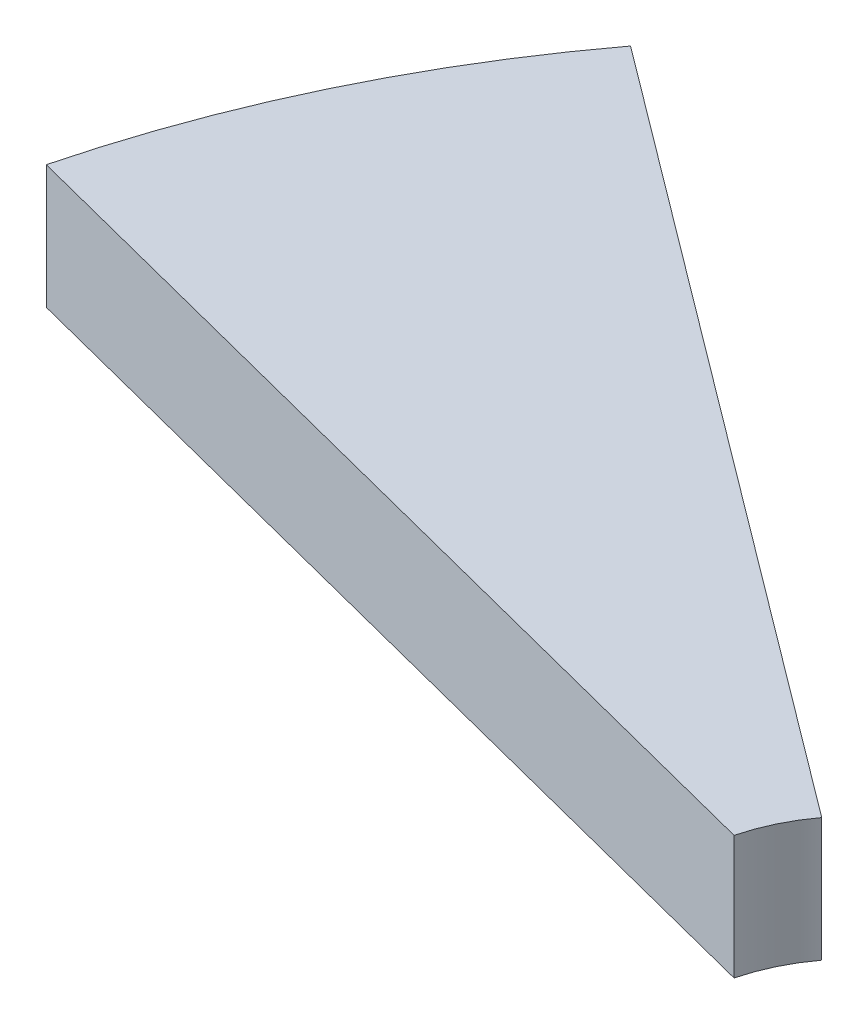
ISO-10303-21;
HEADER;
FILE_DESCRIPTION(('STEP AP214'),'2;1');
FILE_NAME('part.step','',(''),(''),'','','');
FILE_SCHEMA(('AUTOMOTIVE_DESIGN { 1 0 10303 214 1 1 1 1 }'));
ENDSEC;
DATA;
#1=APPLICATION_CONTEXT('core data for automotive mechanical design processes');
#2=APPLICATION_PROTOCOL_DEFINITION('international standard','automotive_design',2000,#1);
#3=PRODUCT_CONTEXT('',#1,'mechanical');
#4=PRODUCT('Part','Part','',(#3));
#5=PRODUCT_RELATED_PRODUCT_CATEGORY('part','',(#4));
#6=PRODUCT_DEFINITION_FORMATION('','',#4);
#7=PRODUCT_DEFINITION_CONTEXT('part definition',#1,'design');
#8=PRODUCT_DEFINITION('design','',#6,#7);
#9=PRODUCT_DEFINITION_SHAPE('','',#8);
#10=(LENGTH_UNIT() NAMED_UNIT(*) SI_UNIT(.MILLI.,.METRE.));
#11=(NAMED_UNIT(*) PLANE_ANGLE_UNIT() SI_UNIT($,.RADIAN.));
#12=(NAMED_UNIT(*) SI_UNIT($,.STERADIAN.) SOLID_ANGLE_UNIT());
#13=UNCERTAINTY_MEASURE_WITH_UNIT(LENGTH_MEASURE(1.E-05),#10,'distance_accuracy_value','');
#14=(GEOMETRIC_REPRESENTATION_CONTEXT(3) GLOBAL_UNCERTAINTY_ASSIGNED_CONTEXT((#13)) GLOBAL_UNIT_ASSIGNED_CONTEXT((#10,
#11,#12)) REPRESENTATION_CONTEXT('',''));
#15=CARTESIAN_POINT('',(0.,0.,0.));
#16=DIRECTION('',(0.,0.,1.));
#17=DIRECTION('',(1.,0.,0.));
#18=AXIS2_PLACEMENT_3D('',#15,#16,#17);
#19=CARTESIAN_POINT('',(-5.76364553610341E-08,252.604579477137,1.13403864458739E-07));
#20=DIRECTION('',(5.59993503864829E-10,-1.,-1.10182641135936E-09));
#21=DIRECTION('',(0.433168727605368,1.23566198245717E-09,-0.901312849916579));
#22=AXIS2_PLACEMENT_3D('',#19,#20,#21);
#23=CYLINDRICAL_SURFACE('',#22,1000.);
#24=CARTESIAN_POINT('',(3.96283006409703E-09,142.604579477137,-7.79704079079124E-09));
#25=DIRECTION('',(-5.59993503864829E-10,1.,1.10182641135936E-09));
#26=DIRECTION('',(-0.433168727605368,-1.23566198245717E-09,0.901312849916579));
#27=AXIS2_PLACEMENT_3D('',#24,#25,#26);
#28=CIRCLE('',#27,1000.);
#29=CARTESIAN_POINT('',(-800.111182686777,142.604579690013,-599.851727798279));
#30=VERTEX_POINT('',#29);
#31=CARTESIAN_POINT('',(-968.713969841785,142.604579208115,-248.179863465115));
#32=VERTEX_POINT('',#31);
#33=EDGE_CURVE('E96',#30,#32,#28,.T.);
#34=ORIENTED_EDGE('',*,*,#33,.T.);
#35=DIRECTION('',(5.59993503864829E-10,-1.,-1.10182641135936E-09));
#36=VECTOR('',#35,1.);
#37=CARTESIAN_POINT('',(-968.713969903384,252.604579208115,-248.179863343914));
#38=LINE('',#37,#36);
#39=CARTESIAN_POINT('',(-968.713969903384,252.604579208115,-248.179863343914));
#40=VERTEX_POINT('',#39);
#41=EDGE_CURVE('E11',#40,#32,#38,.T.);
#42=ORIENTED_EDGE('',*,*,#41,.F.);
#43=CARTESIAN_POINT('',(-5.76364553610341E-08,252.604579477137,1.13403864458739E-07));
#44=DIRECTION('',(-5.59993503864829E-10,1.,1.10182641135936E-09));
#45=DIRECTION('',(-0.433168727605368,-1.23566198245717E-09,0.901312849916579));
#46=AXIS2_PLACEMENT_3D('',#43,#44,#45);
#47=CIRCLE('',#46,1000.);
#48=CARTESIAN_POINT('',(-800.111182748376,252.604579690013,-599.851727677078));
#49=VERTEX_POINT('',#48);
#50=EDGE_CURVE('E84',#49,#40,#47,.T.);
#51=ORIENTED_EDGE('',*,*,#50,.F.);
#52=DIRECTION('',(5.59993503864829E-10,-1.,-1.10182641135936E-09));
#53=VECTOR('',#52,1.);
#54=CARTESIAN_POINT('',(-800.111182748376,252.604579690013,-599.851727677078));
#55=LINE('',#54,#53);
#56=EDGE_CURVE('E92',#49,#30,#55,.T.);
#57=ORIENTED_EDGE('',*,*,#56,.T.);
#58=EDGE_LOOP('',(#34,#42,#51,#57));
#59=FACE_BOUND('',#58,.T.);
#60=ADVANCED_FACE('F33',(#59),#23,.T.);
#61=CARTESIAN_POINT('',(-145.307095534499,252.604579436784,-37.2269794051938));
#62=DIRECTION('',(0.248179863457318,1.20633375432213E-09,-0.968713969845747));
#63=DIRECTION('',(-0.968713969845747,-2.69022402573803E-10,-0.248179863457318));
#64=AXIS2_PLACEMENT_3D('',#61,#62,#63);
#65=PLANE('',#64);
#66=DIRECTION('',(0.968713969845747,2.69022402573803E-10,0.248179863457318));
#67=VECTOR('',#66,1.);
#68=CARTESIAN_POINT('',(-145.307095472899,142.604579436784,-37.2269795263947));
#69=LINE('',#68,#67);
#70=CARTESIAN_POINT('',(-145.307095472899,142.604579436784,-37.2269795263947));
#71=VERTEX_POINT('',#70);
#72=EDGE_CURVE('E88',#32,#71,#69,.T.);
#73=ORIENTED_EDGE('',*,*,#72,.T.);
#74=DIRECTION('',(5.59993503864829E-10,-1.,-1.10182641135936E-09));
#75=VECTOR('',#74,1.);
#76=CARTESIAN_POINT('',(-145.307095534499,252.604579436784,-37.2269794051938));
#77=LINE('',#76,#75);
#78=CARTESIAN_POINT('',(-145.307095534499,252.604579436784,-37.2269794051938));
#79=VERTEX_POINT('',#78);
#80=EDGE_CURVE('E41',#79,#71,#77,.T.);
#81=ORIENTED_EDGE('',*,*,#80,.F.);
#82=DIRECTION('',(0.968713969845747,2.69022402573803E-10,0.248179863457318));
#83=VECTOR('',#82,1.);
#84=CARTESIAN_POINT('',(-145.307095534499,252.604579436784,-37.2269794051938));
#85=LINE('',#84,#83);
#86=EDGE_CURVE('E79',#40,#79,#85,.T.);
#87=ORIENTED_EDGE('',*,*,#86,.F.);
#88=ORIENTED_EDGE('',*,*,#41,.T.);
#89=EDGE_LOOP('',(#73,#81,#87,#88));
#90=FACE_BOUND('',#89,.T.);
#91=ADVANCED_FACE('F87',(#90),#65,.F.);
#92=CARTESIAN_POINT('',(-5.76364553610341E-08,252.604579477137,1.13403864458739E-07));
#93=DIRECTION('',(5.59993503864829E-10,-1.,-1.10182641135936E-09));
#94=DIRECTION('',(0.433168727605368,1.23566198245717E-09,-0.901312849916579));
#95=AXIS2_PLACEMENT_3D('',#92,#93,#94);
#96=CYLINDRICAL_SURFACE('',#95,150.);
#97=CARTESIAN_POINT('',(3.96283006409703E-09,142.604579477137,-7.79704079079124E-09));
#98=DIRECTION('',(5.59993503864829E-10,-1.,-1.10182641135936E-09));
#99=DIRECTION('',(-0.433168727605368,-1.23566198245717E-09,0.901312849916579));
#100=AXIS2_PLACEMENT_3D('',#97,#98,#99);
#101=CIRCLE('',#100,150.);
#102=CARTESIAN_POINT('',(-120.016677399648,142.604579509069,-89.9777591763693));
#103=VERTEX_POINT('',#102);
#104=EDGE_CURVE('E66',#71,#103,#101,.T.);
#105=ORIENTED_EDGE('',*,*,#104,.T.);
#106=DIRECTION('',(5.59993503864829E-10,-1.,-1.10182641135936E-09));
#107=VECTOR('',#106,1.);
#108=CARTESIAN_POINT('',(-120.016677461247,252.604579509069,-89.9777590551684));
#109=LINE('',#108,#107);
#110=CARTESIAN_POINT('',(-120.016677461247,252.604579509069,-89.9777590551684));
#111=VERTEX_POINT('',#110);
#112=EDGE_CURVE('E89',#111,#103,#109,.T.);
#113=ORIENTED_EDGE('',*,*,#112,.F.);
#114=CARTESIAN_POINT('',(-5.76364553610341E-08,252.604579477137,1.13403864458739E-07));
#115=DIRECTION('',(5.59993503864829E-10,-1.,-1.10182641135936E-09));
#116=DIRECTION('',(-0.433168727605368,-1.23566198245717E-09,0.901312849916579));
#117=AXIS2_PLACEMENT_3D('',#114,#115,#116);
#118=CIRCLE('',#117,150.);
#119=EDGE_CURVE('E82',#79,#111,#118,.T.);
#120=ORIENTED_EDGE('',*,*,#119,.F.);
#121=ORIENTED_EDGE('',*,*,#80,.T.);
#122=EDGE_LOOP('',(#105,#113,#120,#121));
#123=FACE_BOUND('',#122,.T.);
#124=ADVANCED_FACE('F90',(#123),#96,.F.);
#125=CARTESIAN_POINT('',(-120.016677461247,252.604579509069,-89.9777590551684));
#126=DIRECTION('',(-0.599851727790482,-1.21749670973159E-09,0.80011118269074));
#127=DIRECTION('',(0.80011118269074,-2.12875413555147E-10,0.599851727790482));
#128=AXIS2_PLACEMENT_3D('',#125,#126,#127);
#129=PLANE('',#128);
#130=DIRECTION('',(-0.80011118269074,2.12875413555147E-10,-0.599851727790482));
#131=VECTOR('',#130,1.);
#132=CARTESIAN_POINT('',(-120.016677399648,142.604579509069,-89.9777591763693));
#133=LINE('',#132,#131);
#134=EDGE_CURVE('E72',#103,#30,#133,.T.);
#135=ORIENTED_EDGE('',*,*,#134,.T.);
#136=ORIENTED_EDGE('',*,*,#56,.F.);
#137=DIRECTION('',(-0.80011118269074,2.12875413555147E-10,-0.599851727790482));
#138=VECTOR('',#137,1.);
#139=CARTESIAN_POINT('',(-120.016677461247,252.604579509069,-89.9777590551684));
#140=LINE('',#139,#138);
#141=EDGE_CURVE('E49',#111,#49,#140,.T.);
#142=ORIENTED_EDGE('',*,*,#141,.F.);
#143=ORIENTED_EDGE('',*,*,#112,.T.);
#144=EDGE_LOOP('',(#135,#136,#142,#143));
#145=FACE_BOUND('',#144,.T.);
#146=ADVANCED_FACE('F103',(#145),#129,.F.);
#147=CARTESIAN_POINT('',(-5.76364553610341E-08,252.604579477137,1.13403864458739E-07));
#148=DIRECTION('',(-5.59993503864829E-10,1.,1.10182641135936E-09));
#149=DIRECTION('',(-0.433168727605368,-1.23566198245717E-09,0.901312849916579));
#150=AXIS2_PLACEMENT_3D('',#147,#148,#149);
#151=PLANE('',#150);
#152=ORIENTED_EDGE('',*,*,#50,.T.);
#153=ORIENTED_EDGE('',*,*,#86,.T.);
#154=ORIENTED_EDGE('',*,*,#119,.T.);
#155=ORIENTED_EDGE('',*,*,#141,.T.);
#156=EDGE_LOOP('',(#152,#153,#154,#155));
#157=FACE_BOUND('',#156,.T.);
#158=ADVANCED_FACE('F80',(#157),#151,.T.);
#159=CARTESIAN_POINT('',(3.96283006409703E-09,142.604579477137,-7.79704079079124E-09));
#160=DIRECTION('',(-5.59993503864829E-10,1.,1.10182641135936E-09));
#161=DIRECTION('',(-0.433168727605368,-1.23566198245717E-09,0.901312849916579));
#162=AXIS2_PLACEMENT_3D('',#159,#160,#161);
#163=PLANE('',#162);
#164=ORIENTED_EDGE('',*,*,#33,.F.);
#165=ORIENTED_EDGE('',*,*,#134,.F.);
#166=ORIENTED_EDGE('',*,*,#104,.F.);
#167=ORIENTED_EDGE('',*,*,#72,.F.);
#168=EDGE_LOOP('',(#164,#165,#166,#167));
#169=FACE_BOUND('',#168,.T.);
#170=ADVANCED_FACE('F106',(#169),#163,.F.);
#171=CLOSED_SHELL('',(#60,#91,#124,#146,#158,#170));
#172=MANIFOLD_SOLID_BREP('B2',#171);
#173=ADVANCED_BREP_SHAPE_REPRESENTATION('',(#18,#172),#14);
#174=SHAPE_DEFINITION_REPRESENTATION(#9,#173);
ENDSEC;
END-ISO-10303-21;
